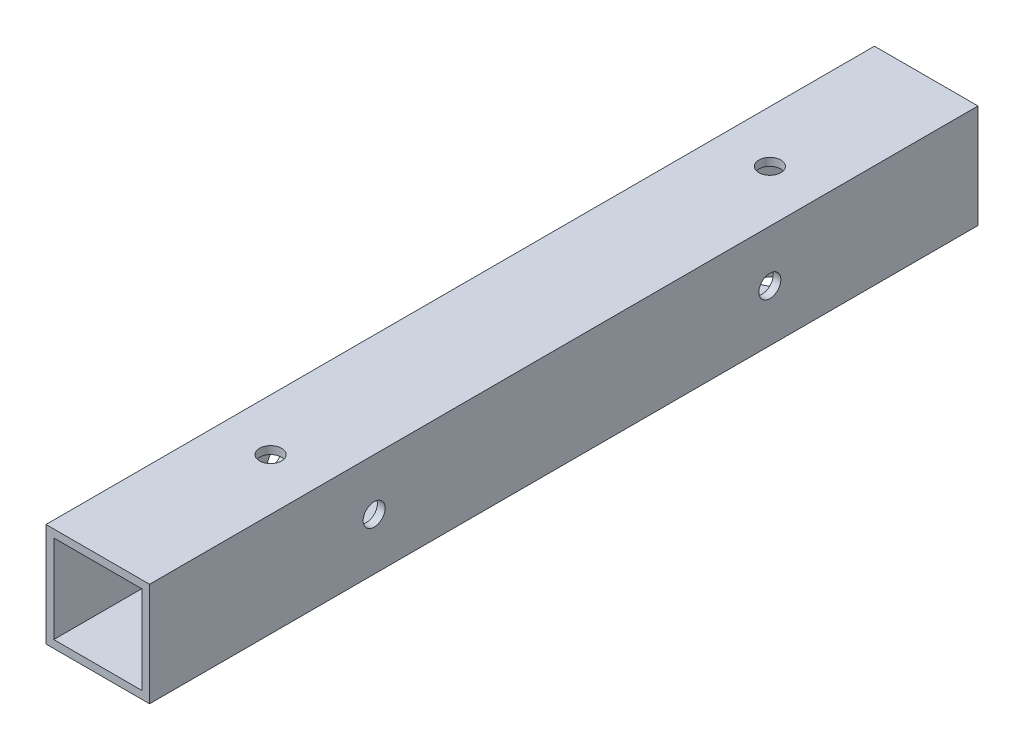
ISO-10303-21;
HEADER;
FILE_DESCRIPTION(('STEP AP214'),'2;1');
FILE_NAME('part.step','',(''),(''),'','','');
FILE_SCHEMA(('AUTOMOTIVE_DESIGN { 1 0 10303 214 1 1 1 1 }'));
ENDSEC;
DATA;
#1=APPLICATION_CONTEXT('core data for automotive mechanical design processes');
#2=APPLICATION_PROTOCOL_DEFINITION('international standard','automotive_design',2000,#1);
#3=PRODUCT_CONTEXT('',#1,'mechanical');
#4=PRODUCT('Part','Part','',(#3));
#5=PRODUCT_RELATED_PRODUCT_CATEGORY('part','',(#4));
#6=PRODUCT_DEFINITION_FORMATION('','',#4);
#7=PRODUCT_DEFINITION_CONTEXT('part definition',#1,'design');
#8=PRODUCT_DEFINITION('design','',#6,#7);
#9=PRODUCT_DEFINITION_SHAPE('','',#8);
#10=(LENGTH_UNIT() NAMED_UNIT(*) SI_UNIT(.MILLI.,.METRE.));
#11=(NAMED_UNIT(*) PLANE_ANGLE_UNIT() SI_UNIT($,.RADIAN.));
#12=(NAMED_UNIT(*) SI_UNIT($,.STERADIAN.) SOLID_ANGLE_UNIT());
#13=UNCERTAINTY_MEASURE_WITH_UNIT(LENGTH_MEASURE(1.E-05),#10,'distance_accuracy_value','');
#14=(GEOMETRIC_REPRESENTATION_CONTEXT(3) GLOBAL_UNCERTAINTY_ASSIGNED_CONTEXT((#13)) GLOBAL_UNIT_ASSIGNED_CONTEXT((#10,
#11,#12)) REPRESENTATION_CONTEXT('',''));
#15=CARTESIAN_POINT('',(0.,0.,0.));
#16=DIRECTION('',(0.,0.,1.));
#17=DIRECTION('',(1.,0.,0.));
#18=AXIS2_PLACEMENT_3D('',#15,#16,#17);
#19=CARTESIAN_POINT('',(10.,-9.99999999999999,-160.));
#20=DIRECTION('',(1.,0.,0.));
#21=DIRECTION('',(0.,0.,-1.));
#22=AXIS2_PLACEMENT_3D('',#19,#20,#21);
#23=PLANE('',#22);
#24=CARTESIAN_POINT('',(10.,0.,-43.375));
#25=DIRECTION('',(-1.,0.,0.));
#26=DIRECTION('',(0.,0.,1.));
#27=AXIS2_PLACEMENT_3D('',#24,#25,#26);
#28=CIRCLE('',#27,2.125);
#29=CARTESIAN_POINT('',(10.,0.,-41.25));
#30=VERTEX_POINT('',#29);
#31=EDGE_CURVE('E184',#30,#30,#28,.T.);
#32=ORIENTED_EDGE('',*,*,#31,.T.);
#33=EDGE_LOOP('',(#32));
#34=FACE_BOUND('',#33,.T.);
#35=CARTESIAN_POINT('',(10.,0.,-119.8));
#36=DIRECTION('',(-1.,0.,0.));
#37=DIRECTION('',(0.,0.,1.));
#38=AXIS2_PLACEMENT_3D('',#35,#36,#37);
#39=CIRCLE('',#38,2.12499999999997);
#40=CARTESIAN_POINT('',(10.,0.,-117.675));
#41=VERTEX_POINT('',#40);
#42=EDGE_CURVE('E200',#41,#41,#39,.T.);
#43=ORIENTED_EDGE('',*,*,#42,.T.);
#44=EDGE_LOOP('',(#43));
#45=FACE_BOUND('',#44,.T.);
#46=DIRECTION('',(0.,1.,0.));
#47=VECTOR('',#46,1.);
#48=CARTESIAN_POINT('',(10.,-9.99999999999999,0.));
#49=LINE('',#48,#47);
#50=CARTESIAN_POINT('',(10.,-9.99999999999999,0.));
#51=VERTEX_POINT('',#50);
#52=CARTESIAN_POINT('',(10.,10.,0.));
#53=VERTEX_POINT('',#52);
#54=EDGE_CURVE('E142',#51,#53,#49,.T.);
#55=ORIENTED_EDGE('',*,*,#54,.F.);
#56=DIRECTION('',(0.,0.,1.));
#57=VECTOR('',#56,1.);
#58=CARTESIAN_POINT('',(10.,-9.99999999999999,-160.));
#59=LINE('',#58,#57);
#60=CARTESIAN_POINT('',(10.,-9.99999999999999,-160.));
#61=VERTEX_POINT('',#60);
#62=EDGE_CURVE('E11',#61,#51,#59,.T.);
#63=ORIENTED_EDGE('',*,*,#62,.F.);
#64=DIRECTION('',(0.,1.,0.));
#65=VECTOR('',#64,1.);
#66=CARTESIAN_POINT('',(10.,-9.99999999999999,-160.));
#67=LINE('',#66,#65);
#68=CARTESIAN_POINT('',(10.,10.,-160.));
#69=VERTEX_POINT('',#68);
#70=EDGE_CURVE('E146',#61,#69,#67,.T.);
#71=ORIENTED_EDGE('',*,*,#70,.T.);
#72=DIRECTION('',(0.,0.,1.));
#73=VECTOR('',#72,1.);
#74=CARTESIAN_POINT('',(10.,10.,-160.));
#75=LINE('',#74,#73);
#76=EDGE_CURVE('E159',#69,#53,#75,.T.);
#77=ORIENTED_EDGE('',*,*,#76,.T.);
#78=EDGE_LOOP('',(#55,#63,#71,#77));
#79=FACE_BOUND('',#78,.T.);
#80=ADVANCED_FACE('F41',(#34,#45,#79),#23,.T.);
#81=CARTESIAN_POINT('',(-9.99999999999998,-9.99999999999999,-160.));
#82=DIRECTION('',(0.,-1.,0.));
#83=DIRECTION('',(0.,0.,-1.));
#84=AXIS2_PLACEMENT_3D('',#81,#82,#83);
#85=PLANE('',#84);
#86=CARTESIAN_POINT('',(0.,-9.99999999999999,-33.375));
#87=DIRECTION('',(0.,1.,0.));
#88=DIRECTION('',(0.,0.,1.));
#89=AXIS2_PLACEMENT_3D('',#86,#87,#88);
#90=CIRCLE('',#89,2.125);
#91=CARTESIAN_POINT('',(0.,-9.99999999999999,-31.25));
#92=VERTEX_POINT('',#91);
#93=EDGE_CURVE('E178',#92,#92,#90,.T.);
#94=ORIENTED_EDGE('',*,*,#93,.T.);
#95=EDGE_LOOP('',(#94));
#96=FACE_BOUND('',#95,.T.);
#97=CARTESIAN_POINT('',(0.,-9.99999999999999,-129.8));
#98=DIRECTION('',(0.,1.,0.));
#99=DIRECTION('',(0.,0.,1.));
#100=AXIS2_PLACEMENT_3D('',#97,#98,#99);
#101=CIRCLE('',#100,2.125);
#102=CARTESIAN_POINT('',(0.,-9.99999999999999,-127.675));
#103=VERTEX_POINT('',#102);
#104=EDGE_CURVE('E206',#103,#103,#101,.T.);
#105=ORIENTED_EDGE('',*,*,#104,.T.);
#106=EDGE_LOOP('',(#105));
#107=FACE_BOUND('',#106,.T.);
#108=DIRECTION('',(1.,0.,0.));
#109=VECTOR('',#108,1.);
#110=CARTESIAN_POINT('',(-9.99999999999998,-9.99999999999999,0.));
#111=LINE('',#110,#109);
#112=CARTESIAN_POINT('',(-9.99999999999998,-9.99999999999999,0.));
#113=VERTEX_POINT('',#112);
#114=EDGE_CURVE('E150',#113,#51,#111,.T.);
#115=ORIENTED_EDGE('',*,*,#114,.F.);
#116=DIRECTION('',(0.,0.,1.));
#117=VECTOR('',#116,1.);
#118=CARTESIAN_POINT('',(-9.99999999999998,-9.99999999999999,-160.));
#119=LINE('',#118,#117);
#120=CARTESIAN_POINT('',(-9.99999999999998,-9.99999999999999,-160.));
#121=VERTEX_POINT('',#120);
#122=EDGE_CURVE('E49',#121,#113,#119,.T.);
#123=ORIENTED_EDGE('',*,*,#122,.F.);
#124=DIRECTION('',(1.,0.,0.));
#125=VECTOR('',#124,1.);
#126=CARTESIAN_POINT('',(-9.99999999999998,-9.99999999999999,-160.));
#127=LINE('',#126,#125);
#128=EDGE_CURVE('E156',#121,#61,#127,.T.);
#129=ORIENTED_EDGE('',*,*,#128,.T.);
#130=ORIENTED_EDGE('',*,*,#62,.T.);
#131=EDGE_LOOP('',(#115,#123,#129,#130));
#132=FACE_BOUND('',#131,.T.);
#133=ADVANCED_FACE('F241',(#96,#107,#132),#85,.T.);
#134=CARTESIAN_POINT('',(-9.99999999999998,-9.99999999999999,-160.));
#135=DIRECTION('',(-1.,0.,0.));
#136=DIRECTION('',(0.,0.,1.));
#137=AXIS2_PLACEMENT_3D('',#134,#135,#136);
#138=PLANE('',#137);
#139=CARTESIAN_POINT('',(-9.99999999999998,0.,-43.375));
#140=DIRECTION('',(-1.,0.,0.));
#141=DIRECTION('',(0.,0.,1.));
#142=AXIS2_PLACEMENT_3D('',#139,#140,#141);
#143=CIRCLE('',#142,2.125);
#144=CARTESIAN_POINT('',(-9.99999999999998,0.,-41.25));
#145=VERTEX_POINT('',#144);
#146=EDGE_CURVE('E190',#145,#145,#143,.T.);
#147=ORIENTED_EDGE('',*,*,#146,.F.);
#148=EDGE_LOOP('',(#147));
#149=FACE_BOUND('',#148,.T.);
#150=CARTESIAN_POINT('',(-9.99999999999998,0.,-119.8));
#151=DIRECTION('',(-1.,0.,0.));
#152=DIRECTION('',(0.,0.,1.));
#153=AXIS2_PLACEMENT_3D('',#150,#151,#152);
#154=CIRCLE('',#153,2.12499999999997);
#155=CARTESIAN_POINT('',(-9.99999999999998,0.,-117.675));
#156=VERTEX_POINT('',#155);
#157=EDGE_CURVE('E195',#156,#156,#154,.T.);
#158=ORIENTED_EDGE('',*,*,#157,.F.);
#159=EDGE_LOOP('',(#158));
#160=FACE_BOUND('',#159,.T.);
#161=DIRECTION('',(0.,-1.,0.));
#162=VECTOR('',#161,1.);
#163=CARTESIAN_POINT('',(-9.99999999999998,-9.99999999999999,0.));
#164=LINE('',#163,#162);
#165=CARTESIAN_POINT('',(-9.99999999999998,10.,0.));
#166=VERTEX_POINT('',#165);
#167=EDGE_CURVE('E165',#166,#113,#164,.T.);
#168=ORIENTED_EDGE('',*,*,#167,.F.);
#169=DIRECTION('',(0.,0.,1.));
#170=VECTOR('',#169,1.);
#171=CARTESIAN_POINT('',(-9.99999999999998,10.,-160.));
#172=LINE('',#171,#170);
#173=CARTESIAN_POINT('',(-9.99999999999998,10.,-160.));
#174=VERTEX_POINT('',#173);
#175=EDGE_CURVE('E171',#174,#166,#172,.T.);
#176=ORIENTED_EDGE('',*,*,#175,.F.);
#177=DIRECTION('',(0.,-1.,0.));
#178=VECTOR('',#177,1.);
#179=CARTESIAN_POINT('',(-9.99999999999998,-9.99999999999999,-160.));
#180=LINE('',#179,#178);
#181=EDGE_CURVE('E153',#174,#121,#180,.T.);
#182=ORIENTED_EDGE('',*,*,#181,.T.);
#183=ORIENTED_EDGE('',*,*,#122,.T.);
#184=EDGE_LOOP('',(#168,#176,#182,#183));
#185=FACE_BOUND('',#184,.T.);
#186=ADVANCED_FACE('F246',(#149,#160,#185),#138,.T.);
#187=CARTESIAN_POINT('',(-9.99999999999998,10.,-160.));
#188=DIRECTION('',(0.,1.,0.));
#189=DIRECTION('',(0.,0.,1.));
#190=AXIS2_PLACEMENT_3D('',#187,#188,#189);
#191=PLANE('',#190);
#192=CARTESIAN_POINT('',(0.,10.,-33.375));
#193=DIRECTION('',(0.,1.,0.));
#194=DIRECTION('',(0.,0.,1.));
#195=AXIS2_PLACEMENT_3D('',#192,#193,#194);
#196=CIRCLE('',#195,2.125);
#197=CARTESIAN_POINT('',(0.,10.,-31.25));
#198=VERTEX_POINT('',#197);
#199=EDGE_CURVE('E209',#198,#198,#196,.T.);
#200=ORIENTED_EDGE('',*,*,#199,.F.);
#201=EDGE_LOOP('',(#200));
#202=FACE_BOUND('',#201,.T.);
#203=CARTESIAN_POINT('',(0.,10.,-129.8));
#204=DIRECTION('',(0.,1.,0.));
#205=DIRECTION('',(0.,0.,1.));
#206=AXIS2_PLACEMENT_3D('',#203,#204,#205);
#207=CIRCLE('',#206,2.125);
#208=CARTESIAN_POINT('',(0.,10.,-127.675));
#209=VERTEX_POINT('',#208);
#210=EDGE_CURVE('E212',#209,#209,#207,.T.);
#211=ORIENTED_EDGE('',*,*,#210,.F.);
#212=EDGE_LOOP('',(#211));
#213=FACE_BOUND('',#212,.T.);
#214=DIRECTION('',(-1.,0.,0.));
#215=VECTOR('',#214,1.);
#216=CARTESIAN_POINT('',(-9.99999999999998,10.,0.));
#217=LINE('',#216,#215);
#218=EDGE_CURVE('E162',#53,#166,#217,.T.);
#219=ORIENTED_EDGE('',*,*,#218,.F.);
#220=ORIENTED_EDGE('',*,*,#76,.F.);
#221=DIRECTION('',(-1.,0.,0.));
#222=VECTOR('',#221,1.);
#223=CARTESIAN_POINT('',(-9.99999999999998,10.,-160.));
#224=LINE('',#223,#222);
#225=EDGE_CURVE('E149',#69,#174,#224,.T.);
#226=ORIENTED_EDGE('',*,*,#225,.T.);
#227=ORIENTED_EDGE('',*,*,#175,.T.);
#228=EDGE_LOOP('',(#219,#220,#226,#227));
#229=FACE_BOUND('',#228,.T.);
#230=ADVANCED_FACE('F264',(#202,#213,#229),#191,.T.);
#231=CARTESIAN_POINT('',(0.,0.,-160.));
#232=DIRECTION('',(0.,0.,-1.));
#233=DIRECTION('',(-1.,0.,0.));
#234=AXIS2_PLACEMENT_3D('',#231,#232,#233);
#235=PLANE('',#234);
#236=DIRECTION('',(0.,-1.,0.));
#237=VECTOR('',#236,1.);
#238=CARTESIAN_POINT('',(-8.49999999999998,-8.49999999999999,-160.));
#239=LINE('',#238,#237);
#240=CARTESIAN_POINT('',(-8.49999999999998,8.50000000000002,-160.));
#241=VERTEX_POINT('',#240);
#242=CARTESIAN_POINT('',(-8.49999999999998,-8.49999999999999,-160.));
#243=VERTEX_POINT('',#242);
#244=EDGE_CURVE('E108',#241,#243,#239,.T.);
#245=ORIENTED_EDGE('',*,*,#244,.T.);
#246=DIRECTION('',(1.,0.,0.));
#247=VECTOR('',#246,1.);
#248=CARTESIAN_POINT('',(-8.49999999999998,-8.49999999999999,-160.));
#249=LINE('',#248,#247);
#250=CARTESIAN_POINT('',(8.50000000000002,-8.49999999999999,-160.));
#251=VERTEX_POINT('',#250);
#252=EDGE_CURVE('E117',#243,#251,#249,.T.);
#253=ORIENTED_EDGE('',*,*,#252,.T.);
#254=DIRECTION('',(0.,1.,0.));
#255=VECTOR('',#254,1.);
#256=CARTESIAN_POINT('',(8.50000000000002,-8.49999999999999,-160.));
#257=LINE('',#256,#255);
#258=CARTESIAN_POINT('',(8.50000000000002,8.50000000000002,-160.));
#259=VERTEX_POINT('',#258);
#260=EDGE_CURVE('E57',#251,#259,#257,.T.);
#261=ORIENTED_EDGE('',*,*,#260,.T.);
#262=DIRECTION('',(-1.,0.,0.));
#263=VECTOR('',#262,1.);
#264=CARTESIAN_POINT('',(-8.49999999999998,8.50000000000002,-160.));
#265=LINE('',#264,#263);
#266=EDGE_CURVE('E114',#259,#241,#265,.T.);
#267=ORIENTED_EDGE('',*,*,#266,.T.);
#268=EDGE_LOOP('',(#245,#253,#261,#267));
#269=FACE_BOUND('',#268,.T.);
#270=ORIENTED_EDGE('',*,*,#70,.F.);
#271=ORIENTED_EDGE('',*,*,#128,.F.);
#272=ORIENTED_EDGE('',*,*,#181,.F.);
#273=ORIENTED_EDGE('',*,*,#225,.F.);
#274=EDGE_LOOP('',(#270,#271,#272,#273));
#275=FACE_BOUND('',#274,.T.);
#276=ADVANCED_FACE('F121',(#269,#275),#235,.T.);
#277=CARTESIAN_POINT('',(0.,0.,0.));
#278=DIRECTION('',(0.,0.,-1.));
#279=DIRECTION('',(-1.,0.,0.));
#280=AXIS2_PLACEMENT_3D('',#277,#278,#279);
#281=PLANE('',#280);
#282=DIRECTION('',(1.,0.,0.));
#283=VECTOR('',#282,1.);
#284=CARTESIAN_POINT('',(-8.49999999999998,-8.49999999999999,0.));
#285=LINE('',#284,#283);
#286=CARTESIAN_POINT('',(-8.49999999999998,-8.49999999999999,0.));
#287=VERTEX_POINT('',#286);
#288=CARTESIAN_POINT('',(8.50000000000002,-8.49999999999999,0.));
#289=VERTEX_POINT('',#288);
#290=EDGE_CURVE('E136',#287,#289,#285,.T.);
#291=ORIENTED_EDGE('',*,*,#290,.F.);
#292=DIRECTION('',(0.,-1.,0.));
#293=VECTOR('',#292,1.);
#294=CARTESIAN_POINT('',(-8.49999999999998,-8.49999999999999,0.));
#295=LINE('',#294,#293);
#296=CARTESIAN_POINT('',(-8.49999999999998,8.50000000000002,0.));
#297=VERTEX_POINT('',#296);
#298=EDGE_CURVE('E65',#297,#287,#295,.T.);
#299=ORIENTED_EDGE('',*,*,#298,.F.);
#300=DIRECTION('',(-1.,0.,0.));
#301=VECTOR('',#300,1.);
#302=CARTESIAN_POINT('',(-8.49999999999998,8.50000000000002,0.));
#303=LINE('',#302,#301);
#304=CARTESIAN_POINT('',(8.50000000000002,8.50000000000002,0.));
#305=VERTEX_POINT('',#304);
#306=EDGE_CURVE('E124',#305,#297,#303,.T.);
#307=ORIENTED_EDGE('',*,*,#306,.F.);
#308=DIRECTION('',(0.,1.,0.));
#309=VECTOR('',#308,1.);
#310=CARTESIAN_POINT('',(8.50000000000002,-8.49999999999999,0.));
#311=LINE('',#310,#309);
#312=EDGE_CURVE('E127',#289,#305,#311,.T.);
#313=ORIENTED_EDGE('',*,*,#312,.F.);
#314=EDGE_LOOP('',(#291,#299,#307,#313));
#315=FACE_BOUND('',#314,.T.);
#316=ORIENTED_EDGE('',*,*,#54,.T.);
#317=ORIENTED_EDGE('',*,*,#218,.T.);
#318=ORIENTED_EDGE('',*,*,#167,.T.);
#319=ORIENTED_EDGE('',*,*,#114,.T.);
#320=EDGE_LOOP('',(#316,#317,#318,#319));
#321=FACE_BOUND('',#320,.T.);
#322=ADVANCED_FACE('F257',(#315,#321),#281,.F.);
#323=CARTESIAN_POINT('',(-8.49999999999998,-8.49999999999999,-160.));
#324=DIRECTION('',(-1.,0.,0.));
#325=DIRECTION('',(0.,0.,1.));
#326=AXIS2_PLACEMENT_3D('',#323,#324,#325);
#327=PLANE('',#326);
#328=CARTESIAN_POINT('',(-8.49999999999998,0.,-43.375));
#329=DIRECTION('',(-1.,0.,0.));
#330=DIRECTION('',(0.,0.,1.));
#331=AXIS2_PLACEMENT_3D('',#328,#329,#330);
#332=CIRCLE('',#331,2.125);
#333=CARTESIAN_POINT('',(-8.49999999999998,0.,-41.25));
#334=VERTEX_POINT('',#333);
#335=EDGE_CURVE('E203',#334,#334,#332,.T.);
#336=ORIENTED_EDGE('',*,*,#335,.T.);
#337=EDGE_LOOP('',(#336));
#338=FACE_BOUND('',#337,.T.);
#339=CARTESIAN_POINT('',(-8.49999999999998,0.,-119.8));
#340=DIRECTION('',(-1.,0.,0.));
#341=DIRECTION('',(0.,0.,1.));
#342=AXIS2_PLACEMENT_3D('',#339,#340,#341);
#343=CIRCLE('',#342,2.12499999999997);
#344=CARTESIAN_POINT('',(-8.49999999999998,0.,-117.675));
#345=VERTEX_POINT('',#344);
#346=EDGE_CURVE('E183',#345,#345,#343,.T.);
#347=ORIENTED_EDGE('',*,*,#346,.T.);
#348=EDGE_LOOP('',(#347));
#349=FACE_BOUND('',#348,.T.);
#350=ORIENTED_EDGE('',*,*,#298,.T.);
#351=DIRECTION('',(0.,0.,1.));
#352=VECTOR('',#351,1.);
#353=CARTESIAN_POINT('',(-8.49999999999998,-8.49999999999999,-160.));
#354=LINE('',#353,#352);
#355=EDGE_CURVE('E104',#243,#287,#354,.T.);
#356=ORIENTED_EDGE('',*,*,#355,.F.);
#357=ORIENTED_EDGE('',*,*,#244,.F.);
#358=DIRECTION('',(0.,0.,1.));
#359=VECTOR('',#358,1.);
#360=CARTESIAN_POINT('',(-8.49999999999998,8.50000000000002,-160.));
#361=LINE('',#360,#359);
#362=EDGE_CURVE('E140',#241,#297,#361,.T.);
#363=ORIENTED_EDGE('',*,*,#362,.T.);
#364=EDGE_LOOP('',(#350,#356,#357,#363));
#365=FACE_BOUND('',#364,.T.);
#366=ADVANCED_FACE('F106',(#338,#349,#365),#327,.F.);
#367=CARTESIAN_POINT('',(-8.49999999999998,8.50000000000002,-160.));
#368=DIRECTION('',(0.,1.,0.));
#369=DIRECTION('',(0.,0.,1.));
#370=AXIS2_PLACEMENT_3D('',#367,#368,#369);
#371=PLANE('',#370);
#372=CARTESIAN_POINT('',(0.,8.50000000000002,-33.375));
#373=DIRECTION('',(0.,1.,0.));
#374=DIRECTION('',(0.,0.,1.));
#375=AXIS2_PLACEMENT_3D('',#372,#373,#374);
#376=CIRCLE('',#375,2.125);
#377=CARTESIAN_POINT('',(0.,8.50000000000002,-31.25));
#378=VERTEX_POINT('',#377);
#379=EDGE_CURVE('E130',#378,#378,#376,.T.);
#380=ORIENTED_EDGE('',*,*,#379,.T.);
#381=EDGE_LOOP('',(#380));
#382=FACE_BOUND('',#381,.T.);
#383=CARTESIAN_POINT('',(0.,8.50000000000002,-129.8));
#384=DIRECTION('',(0.,1.,0.));
#385=DIRECTION('',(0.,0.,1.));
#386=AXIS2_PLACEMENT_3D('',#383,#384,#385);
#387=CIRCLE('',#386,2.125);
#388=CARTESIAN_POINT('',(0.,8.50000000000002,-127.675));
#389=VERTEX_POINT('',#388);
#390=EDGE_CURVE('E177',#389,#389,#387,.T.);
#391=ORIENTED_EDGE('',*,*,#390,.T.);
#392=EDGE_LOOP('',(#391));
#393=FACE_BOUND('',#392,.T.);
#394=ORIENTED_EDGE('',*,*,#306,.T.);
#395=ORIENTED_EDGE('',*,*,#362,.F.);
#396=ORIENTED_EDGE('',*,*,#266,.F.);
#397=DIRECTION('',(0.,0.,1.));
#398=VECTOR('',#397,1.);
#399=CARTESIAN_POINT('',(8.50000000000002,8.50000000000002,-160.));
#400=LINE('',#399,#398);
#401=EDGE_CURVE('E143',#259,#305,#400,.T.);
#402=ORIENTED_EDGE('',*,*,#401,.T.);
#403=EDGE_LOOP('',(#394,#395,#396,#402));
#404=FACE_BOUND('',#403,.T.);
#405=ADVANCED_FACE('F219',(#382,#393,#404),#371,.F.);
#406=CARTESIAN_POINT('',(8.50000000000002,-8.49999999999999,-160.));
#407=DIRECTION('',(1.,0.,0.));
#408=DIRECTION('',(0.,0.,-1.));
#409=AXIS2_PLACEMENT_3D('',#406,#407,#408);
#410=PLANE('',#409);
#411=CARTESIAN_POINT('',(8.50000000000002,0.,-43.375));
#412=DIRECTION('',(1.,0.,0.));
#413=DIRECTION('',(0.,0.,-1.));
#414=AXIS2_PLACEMENT_3D('',#411,#412,#413);
#415=CIRCLE('',#414,2.125);
#416=CARTESIAN_POINT('',(8.50000000000002,0.,-45.5));
#417=VERTEX_POINT('',#416);
#418=EDGE_CURVE('E44',#417,#417,#415,.T.);
#419=ORIENTED_EDGE('',*,*,#418,.T.);
#420=EDGE_LOOP('',(#419));
#421=FACE_BOUND('',#420,.T.);
#422=CARTESIAN_POINT('',(8.50000000000002,0.,-119.8));
#423=DIRECTION('',(1.,0.,0.));
#424=DIRECTION('',(0.,0.,-1.));
#425=AXIS2_PLACEMENT_3D('',#422,#423,#424);
#426=CIRCLE('',#425,2.12499999999997);
#427=CARTESIAN_POINT('',(8.50000000000002,0.,-121.925));
#428=VERTEX_POINT('',#427);
#429=EDGE_CURVE('E181',#428,#428,#426,.T.);
#430=ORIENTED_EDGE('',*,*,#429,.T.);
#431=EDGE_LOOP('',(#430));
#432=FACE_BOUND('',#431,.T.);
#433=ORIENTED_EDGE('',*,*,#312,.T.);
#434=ORIENTED_EDGE('',*,*,#401,.F.);
#435=ORIENTED_EDGE('',*,*,#260,.F.);
#436=DIRECTION('',(0.,0.,1.));
#437=VECTOR('',#436,1.);
#438=CARTESIAN_POINT('',(8.50000000000002,-8.49999999999999,-160.));
#439=LINE('',#438,#437);
#440=EDGE_CURVE('E113',#251,#289,#439,.T.);
#441=ORIENTED_EDGE('',*,*,#440,.T.);
#442=EDGE_LOOP('',(#433,#434,#435,#441));
#443=FACE_BOUND('',#442,.T.);
#444=ADVANCED_FACE('F285',(#421,#432,#443),#410,.F.);
#445=CARTESIAN_POINT('',(-8.49999999999998,-8.49999999999999,-160.));
#446=DIRECTION('',(0.,-1.,0.));
#447=DIRECTION('',(0.,0.,-1.));
#448=AXIS2_PLACEMENT_3D('',#445,#446,#447);
#449=PLANE('',#448);
#450=CARTESIAN_POINT('',(0.,-8.49999999999999,-33.375));
#451=DIRECTION('',(0.,-1.,0.));
#452=DIRECTION('',(0.,0.,-1.));
#453=AXIS2_PLACEMENT_3D('',#450,#451,#452);
#454=CIRCLE('',#453,2.125);
#455=CARTESIAN_POINT('',(0.,-8.49999999999999,-35.5));
#456=VERTEX_POINT('',#455);
#457=EDGE_CURVE('E179',#456,#456,#454,.T.);
#458=ORIENTED_EDGE('',*,*,#457,.T.);
#459=EDGE_LOOP('',(#458));
#460=FACE_BOUND('',#459,.T.);
#461=CARTESIAN_POINT('',(0.,-8.49999999999999,-129.8));
#462=DIRECTION('',(0.,-1.,0.));
#463=DIRECTION('',(0.,0.,-1.));
#464=AXIS2_PLACEMENT_3D('',#461,#462,#463);
#465=CIRCLE('',#464,2.125);
#466=CARTESIAN_POINT('',(0.,-8.49999999999999,-131.925));
#467=VERTEX_POINT('',#466);
#468=EDGE_CURVE('E174',#467,#467,#465,.T.);
#469=ORIENTED_EDGE('',*,*,#468,.T.);
#470=EDGE_LOOP('',(#469));
#471=FACE_BOUND('',#470,.T.);
#472=ORIENTED_EDGE('',*,*,#290,.T.);
#473=ORIENTED_EDGE('',*,*,#440,.F.);
#474=ORIENTED_EDGE('',*,*,#252,.F.);
#475=ORIENTED_EDGE('',*,*,#355,.T.);
#476=EDGE_LOOP('',(#472,#473,#474,#475));
#477=FACE_BOUND('',#476,.T.);
#478=ADVANCED_FACE('F118',(#460,#471,#477),#449,.F.);
#479=CARTESIAN_POINT('',(0.,-9.99999999999999,-129.8));
#480=DIRECTION('',(0.,1.,0.));
#481=DIRECTION('',(0.,0.,1.));
#482=AXIS2_PLACEMENT_3D('',#479,#480,#481);
#483=CYLINDRICAL_SURFACE('',#482,2.125);
#484=ORIENTED_EDGE('',*,*,#104,.F.);
#485=EDGE_LOOP('',(#484));
#486=FACE_BOUND('',#485,.T.);
#487=ORIENTED_EDGE('',*,*,#468,.F.);
#488=EDGE_LOOP('',(#487));
#489=FACE_BOUND('',#488,.T.);
#490=ADVANCED_FACE('F228',(#486,#489),#483,.F.);
#491=CARTESIAN_POINT('',(0.,-9.99999999999999,-33.375));
#492=DIRECTION('',(0.,1.,0.));
#493=DIRECTION('',(0.,0.,1.));
#494=AXIS2_PLACEMENT_3D('',#491,#492,#493);
#495=CYLINDRICAL_SURFACE('',#494,2.125);
#496=ORIENTED_EDGE('',*,*,#93,.F.);
#497=EDGE_LOOP('',(#496));
#498=FACE_BOUND('',#497,.T.);
#499=ORIENTED_EDGE('',*,*,#457,.F.);
#500=EDGE_LOOP('',(#499));
#501=FACE_BOUND('',#500,.T.);
#502=ADVANCED_FACE('F225',(#498,#501),#495,.F.);
#503=ORIENTED_EDGE('',*,*,#210,.T.);
#504=EDGE_LOOP('',(#503));
#505=FACE_BOUND('',#504,.T.);
#506=ORIENTED_EDGE('',*,*,#390,.F.);
#507=EDGE_LOOP('',(#506));
#508=FACE_BOUND('',#507,.T.);
#509=ADVANCED_FACE('F222',(#505,#508),#483,.F.);
#510=ORIENTED_EDGE('',*,*,#199,.T.);
#511=EDGE_LOOP('',(#510));
#512=FACE_BOUND('',#511,.T.);
#513=ORIENTED_EDGE('',*,*,#379,.F.);
#514=EDGE_LOOP('',(#513));
#515=FACE_BOUND('',#514,.T.);
#516=ADVANCED_FACE('F224',(#512,#515),#495,.F.);
#517=CARTESIAN_POINT('',(10.,0.,-119.8));
#518=DIRECTION('',(-1.,0.,0.));
#519=DIRECTION('',(0.,0.,1.));
#520=AXIS2_PLACEMENT_3D('',#517,#518,#519);
#521=CYLINDRICAL_SURFACE('',#520,2.12499999999997);
#522=ORIENTED_EDGE('',*,*,#42,.F.);
#523=EDGE_LOOP('',(#522));
#524=FACE_BOUND('',#523,.T.);
#525=ORIENTED_EDGE('',*,*,#429,.F.);
#526=EDGE_LOOP('',(#525));
#527=FACE_BOUND('',#526,.T.);
#528=ADVANCED_FACE('F233',(#524,#527),#521,.F.);
#529=CARTESIAN_POINT('',(10.,0.,-43.375));
#530=DIRECTION('',(-1.,0.,0.));
#531=DIRECTION('',(0.,0.,1.));
#532=AXIS2_PLACEMENT_3D('',#529,#530,#531);
#533=CYLINDRICAL_SURFACE('',#532,2.125);
#534=ORIENTED_EDGE('',*,*,#31,.F.);
#535=EDGE_LOOP('',(#534));
#536=FACE_BOUND('',#535,.T.);
#537=ORIENTED_EDGE('',*,*,#418,.F.);
#538=EDGE_LOOP('',(#537));
#539=FACE_BOUND('',#538,.T.);
#540=ADVANCED_FACE('F335',(#536,#539),#533,.F.);
#541=ORIENTED_EDGE('',*,*,#157,.T.);
#542=EDGE_LOOP('',(#541));
#543=FACE_BOUND('',#542,.T.);
#544=ORIENTED_EDGE('',*,*,#346,.F.);
#545=EDGE_LOOP('',(#544));
#546=FACE_BOUND('',#545,.T.);
#547=ADVANCED_FACE('F338',(#543,#546),#521,.F.);
#548=ORIENTED_EDGE('',*,*,#146,.T.);
#549=EDGE_LOOP('',(#548));
#550=FACE_BOUND('',#549,.T.);
#551=ORIENTED_EDGE('',*,*,#335,.F.);
#552=EDGE_LOOP('',(#551));
#553=FACE_BOUND('',#552,.T.);
#554=ADVANCED_FACE('F348',(#550,#553),#533,.F.);
#555=CLOSED_SHELL('',(#80,#133,#186,#230,#276,#322,#366,#405,#444,#478,#490,#502,#509,#516,#528,
#540,#547,#554));
#556=MANIFOLD_SOLID_BREP('B2',#555);
#557=ADVANCED_BREP_SHAPE_REPRESENTATION('',(#18,#556),#14);
#558=SHAPE_DEFINITION_REPRESENTATION(#9,#557);
ENDSEC;
END-ISO-10303-21;
